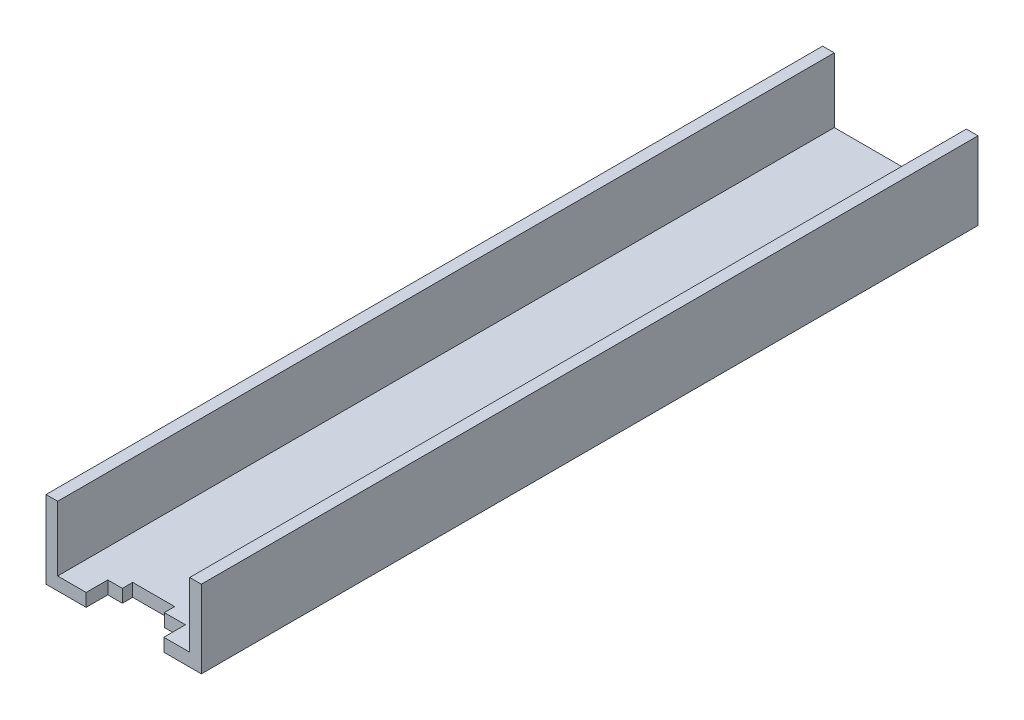
ISO-10303-21;
HEADER;
FILE_DESCRIPTION(('STEP AP214'),'2;1');
FILE_NAME('part.step','',(''),(''),'','','');
FILE_SCHEMA(('AUTOMOTIVE_DESIGN { 1 0 10303 214 1 1 1 1 }'));
ENDSEC;
DATA;
#1=APPLICATION_CONTEXT('core data for automotive mechanical design processes');
#2=APPLICATION_PROTOCOL_DEFINITION('international standard','automotive_design',2000,#1);
#3=PRODUCT_CONTEXT('',#1,'mechanical');
#4=PRODUCT('Part','Part','',(#3));
#5=PRODUCT_RELATED_PRODUCT_CATEGORY('part','',(#4));
#6=PRODUCT_DEFINITION_FORMATION('','',#4);
#7=PRODUCT_DEFINITION_CONTEXT('part definition',#1,'design');
#8=PRODUCT_DEFINITION('design','',#6,#7);
#9=PRODUCT_DEFINITION_SHAPE('','',#8);
#10=(LENGTH_UNIT() NAMED_UNIT(*) SI_UNIT(.MILLI.,.METRE.));
#11=(NAMED_UNIT(*) PLANE_ANGLE_UNIT() SI_UNIT($,.RADIAN.));
#12=(NAMED_UNIT(*) SI_UNIT($,.STERADIAN.) SOLID_ANGLE_UNIT());
#13=UNCERTAINTY_MEASURE_WITH_UNIT(LENGTH_MEASURE(1.E-05),#10,'distance_accuracy_value','');
#14=(GEOMETRIC_REPRESENTATION_CONTEXT(3) GLOBAL_UNCERTAINTY_ASSIGNED_CONTEXT((#13)) GLOBAL_UNIT_ASSIGNED_CONTEXT((#10,
#11,#12)) REPRESENTATION_CONTEXT('',''));
#15=CARTESIAN_POINT('',(0.,0.,0.));
#16=DIRECTION('',(0.,0.,1.));
#17=DIRECTION('',(1.,0.,0.));
#18=AXIS2_PLACEMENT_3D('',#15,#16,#17);
#19=CARTESIAN_POINT('',(-1.45,-1.,29.1635501731022));
#20=DIRECTION('',(0.,0.,-1.));
#21=DIRECTION('',(-1.,0.,0.));
#22=AXIS2_PLACEMENT_3D('',#19,#20,#21);
#23=PLANE('',#22);
#24=DIRECTION('',(0.,-1.,0.));
#25=VECTOR('',#24,1.);
#26=CARTESIAN_POINT('',(0.733411523667505,-1.,29.1635501731022));
#27=LINE('',#26,#25);
#28=CARTESIAN_POINT('',(0.733411523667505,-1.,29.1635501731022));
#29=VERTEX_POINT('',#28);
#30=CARTESIAN_POINT('',(0.733411523667505,-1.5,29.1635501731022));
#31=VERTEX_POINT('',#30);
#32=EDGE_CURVE('E181',#29,#31,#27,.T.);
#33=ORIENTED_EDGE('',*,*,#32,.T.);
#34=DIRECTION('',(1.,0.,0.));
#35=VECTOR('',#34,1.);
#36=CARTESIAN_POINT('',(-1.45,-1.5,29.1635501731022));
#37=LINE('',#36,#35);
#38=CARTESIAN_POINT('',(1.55,-1.5,29.1635501731022));
#39=VERTEX_POINT('',#38);
#40=EDGE_CURVE('E193',#31,#39,#37,.T.);
#41=ORIENTED_EDGE('',*,*,#40,.T.);
#42=DIRECTION('',(0.,-1.,0.));
#43=VECTOR('',#42,1.);
#44=CARTESIAN_POINT('',(1.55,-1.,29.1635501731022));
#45=LINE('',#44,#43);
#46=CARTESIAN_POINT('',(1.55,-1.,29.1635501731022));
#47=VERTEX_POINT('',#46);
#48=EDGE_CURVE('E204',#47,#39,#45,.T.);
#49=ORIENTED_EDGE('',*,*,#48,.F.);
#50=DIRECTION('',(1.,0.,0.));
#51=VECTOR('',#50,1.);
#52=CARTESIAN_POINT('',(-1.45,-1.,29.1635501731022));
#53=LINE('',#52,#51);
#54=EDGE_CURVE('E56',#29,#47,#53,.T.);
#55=ORIENTED_EDGE('',*,*,#54,.F.);
#56=EDGE_LOOP('',(#33,#41,#49,#55));
#57=FACE_BOUND('',#56,.T.);
#58=ADVANCED_FACE('F33',(#57),#23,.F.);
#59=CARTESIAN_POINT('',(0.,0.,30.));
#60=DIRECTION('',(0.,0.,1.));
#61=DIRECTION('',(1.,0.,0.));
#62=AXIS2_PLACEMENT_3D('',#59,#60,#61);
#63=PLANE('',#62);
#64=DIRECTION('',(0.,-1.,0.));
#65=VECTOR('',#64,1.);
#66=CARTESIAN_POINT('',(-1.45,-1.,30.));
#67=LINE('',#66,#65);
#68=CARTESIAN_POINT('',(-1.45,-1.,30.));
#69=VERTEX_POINT('',#68);
#70=CARTESIAN_POINT('',(-1.45,-1.5,30.));
#71=VERTEX_POINT('',#70);
#72=EDGE_CURVE('E198',#69,#71,#67,.T.);
#73=ORIENTED_EDGE('',*,*,#72,.F.);
#74=DIRECTION('',(1.,0.,0.));
#75=VECTOR('',#74,1.);
#76=CARTESIAN_POINT('',(-2.55,-1.,30.));
#77=LINE('',#76,#75);
#78=CARTESIAN_POINT('',(-2.55,-1.,30.));
#79=VERTEX_POINT('',#78);
#80=EDGE_CURVE('E221',#79,#69,#77,.T.);
#81=ORIENTED_EDGE('',*,*,#80,.F.);
#82=DIRECTION('',(0.,-1.,0.));
#83=VECTOR('',#82,1.);
#84=CARTESIAN_POINT('',(-2.55,1.5,30.));
#85=LINE('',#84,#83);
#86=CARTESIAN_POINT('',(-2.55,1.5,30.));
#87=VERTEX_POINT('',#86);
#88=EDGE_CURVE('E211',#87,#79,#85,.T.);
#89=ORIENTED_EDGE('',*,*,#88,.F.);
#90=DIRECTION('',(1.,0.,0.));
#91=VECTOR('',#90,1.);
#92=CARTESIAN_POINT('',(-3.,1.5,30.));
#93=LINE('',#92,#91);
#94=CARTESIAN_POINT('',(-3.,1.5,30.));
#95=VERTEX_POINT('',#94);
#96=EDGE_CURVE('E248',#95,#87,#93,.T.);
#97=ORIENTED_EDGE('',*,*,#96,.F.);
#98=DIRECTION('',(0.,-1.,0.));
#99=VECTOR('',#98,1.);
#100=CARTESIAN_POINT('',(-3.,1.5,30.));
#101=LINE('',#100,#99);
#102=CARTESIAN_POINT('',(-3.,-1.5,30.));
#103=VERTEX_POINT('',#102);
#104=EDGE_CURVE('E236',#95,#103,#101,.T.);
#105=ORIENTED_EDGE('',*,*,#104,.T.);
#106=DIRECTION('',(1.,0.,0.));
#107=VECTOR('',#106,1.);
#108=CARTESIAN_POINT('',(-3.,-1.5,30.));
#109=LINE('',#108,#107);
#110=EDGE_CURVE('E241',#103,#71,#109,.T.);
#111=ORIENTED_EDGE('',*,*,#110,.T.);
#112=EDGE_LOOP('',(#73,#81,#89,#97,#105,#111));
#113=FACE_BOUND('',#112,.T.);
#114=ADVANCED_FACE('F302',(#113),#63,.T.);
#115=CARTESIAN_POINT('',(-3.,1.5,30.));
#116=DIRECTION('',(0.,1.,0.));
#117=DIRECTION('',(0.,0.,1.));
#118=AXIS2_PLACEMENT_3D('',#115,#116,#117);
#119=PLANE('',#118);
#120=DIRECTION('',(1.,0.,0.));
#121=VECTOR('',#120,1.);
#122=CARTESIAN_POINT('',(-3.,1.5,0.));
#123=LINE('',#122,#121);
#124=CARTESIAN_POINT('',(2.55,1.5,0.));
#125=VERTEX_POINT('',#124);
#126=CARTESIAN_POINT('',(3.,1.5,0.));
#127=VERTEX_POINT('',#126);
#128=EDGE_CURVE('E260',#125,#127,#123,.T.);
#129=ORIENTED_EDGE('',*,*,#128,.F.);
#130=DIRECTION('',(0.,0.,1.));
#131=VECTOR('',#130,1.);
#132=CARTESIAN_POINT('',(2.55,1.5,0.));
#133=LINE('',#132,#131);
#134=CARTESIAN_POINT('',(2.55,1.5,30.));
#135=VERTEX_POINT('',#134);
#136=EDGE_CURVE('E232',#125,#135,#133,.T.);
#137=ORIENTED_EDGE('',*,*,#136,.T.);
#138=CARTESIAN_POINT('',(3.,1.5,30.));
#139=VERTEX_POINT('',#138);
#140=EDGE_CURVE('E247',#135,#139,#93,.T.);
#141=ORIENTED_EDGE('',*,*,#140,.T.);
#142=DIRECTION('',(0.,0.,-1.));
#143=VECTOR('',#142,1.);
#144=CARTESIAN_POINT('',(3.,1.5,30.));
#145=LINE('',#144,#143);
#146=EDGE_CURVE('E264',#139,#127,#145,.T.);
#147=ORIENTED_EDGE('',*,*,#146,.T.);
#148=EDGE_LOOP('',(#129,#137,#141,#147));
#149=FACE_BOUND('',#148,.T.);
#150=ADVANCED_FACE('F282',(#149),#119,.T.);
#151=DIRECTION('',(0.,-1.,0.));
#152=VECTOR('',#151,1.);
#153=CARTESIAN_POINT('',(1.55,-1.,30.));
#154=LINE('',#153,#152);
#155=CARTESIAN_POINT('',(1.55,-1.,30.));
#156=VERTEX_POINT('',#155);
#157=CARTESIAN_POINT('',(1.55,-1.5,30.));
#158=VERTEX_POINT('',#157);
#159=EDGE_CURVE('E201',#156,#158,#154,.T.);
#160=ORIENTED_EDGE('',*,*,#159,.T.);
#161=CARTESIAN_POINT('',(3.,-1.5,30.));
#162=VERTEX_POINT('',#161);
#163=EDGE_CURVE('E239',#158,#162,#109,.T.);
#164=ORIENTED_EDGE('',*,*,#163,.T.);
#165=DIRECTION('',(0.,-1.,0.));
#166=VECTOR('',#165,1.);
#167=CARTESIAN_POINT('',(3.,1.5,30.));
#168=LINE('',#167,#166);
#169=EDGE_CURVE('E244',#139,#162,#168,.T.);
#170=ORIENTED_EDGE('',*,*,#169,.F.);
#171=ORIENTED_EDGE('',*,*,#140,.F.);
#172=DIRECTION('',(0.,-1.,0.));
#173=VECTOR('',#172,1.);
#174=CARTESIAN_POINT('',(2.55,1.5,30.));
#175=LINE('',#174,#173);
#176=CARTESIAN_POINT('',(2.55,-1.,30.));
#177=VERTEX_POINT('',#176);
#178=EDGE_CURVE('E200',#135,#177,#175,.T.);
#179=ORIENTED_EDGE('',*,*,#178,.T.);
#180=EDGE_CURVE('E220',#156,#177,#77,.T.);
#181=ORIENTED_EDGE('',*,*,#180,.F.);
#182=EDGE_LOOP('',(#160,#164,#170,#171,#179,#181));
#183=FACE_BOUND('',#182,.T.);
#184=ADVANCED_FACE('F285',(#183),#63,.T.);
#185=CARTESIAN_POINT('',(0.,0.,0.));
#186=DIRECTION('',(0.,0.,1.));
#187=DIRECTION('',(1.,0.,0.));
#188=AXIS2_PLACEMENT_3D('',#185,#186,#187);
#189=PLANE('',#188);
#190=DIRECTION('',(0.,-1.,0.));
#191=VECTOR('',#190,1.);
#192=CARTESIAN_POINT('',(2.55,1.5,0.));
#193=LINE('',#192,#191);
#194=CARTESIAN_POINT('',(2.55,-1.,0.));
#195=VERTEX_POINT('',#194);
#196=EDGE_CURVE('E208',#125,#195,#193,.T.);
#197=ORIENTED_EDGE('',*,*,#196,.F.);
#198=ORIENTED_EDGE('',*,*,#128,.T.);
#199=DIRECTION('',(0.,-1.,0.));
#200=VECTOR('',#199,1.);
#201=CARTESIAN_POINT('',(3.,1.5,0.));
#202=LINE('',#201,#200);
#203=CARTESIAN_POINT('',(3.,-1.5,0.));
#204=VERTEX_POINT('',#203);
#205=EDGE_CURVE('E257',#127,#204,#202,.T.);
#206=ORIENTED_EDGE('',*,*,#205,.T.);
#207=DIRECTION('',(1.,0.,0.));
#208=VECTOR('',#207,1.);
#209=CARTESIAN_POINT('',(-3.,-1.5,0.));
#210=LINE('',#209,#208);
#211=CARTESIAN_POINT('',(-3.,-1.5,0.));
#212=VERTEX_POINT('',#211);
#213=EDGE_CURVE('E254',#212,#204,#210,.T.);
#214=ORIENTED_EDGE('',*,*,#213,.F.);
#215=DIRECTION('',(0.,-1.,0.));
#216=VECTOR('',#215,1.);
#217=CARTESIAN_POINT('',(-3.,1.5,0.));
#218=LINE('',#217,#216);
#219=CARTESIAN_POINT('',(-3.,1.5,0.));
#220=VERTEX_POINT('',#219);
#221=EDGE_CURVE('E235',#220,#212,#218,.T.);
#222=ORIENTED_EDGE('',*,*,#221,.F.);
#223=CARTESIAN_POINT('',(-2.55,1.5,0.));
#224=VERTEX_POINT('',#223);
#225=EDGE_CURVE('E240',#220,#224,#123,.T.);
#226=ORIENTED_EDGE('',*,*,#225,.T.);
#227=DIRECTION('',(0.,-1.,0.));
#228=VECTOR('',#227,1.);
#229=CARTESIAN_POINT('',(-2.55,1.5,0.));
#230=LINE('',#229,#228);
#231=CARTESIAN_POINT('',(-2.55,-1.,0.));
#232=VERTEX_POINT('',#231);
#233=EDGE_CURVE('E214',#224,#232,#230,.T.);
#234=ORIENTED_EDGE('',*,*,#233,.T.);
#235=DIRECTION('',(1.,0.,0.));
#236=VECTOR('',#235,1.);
#237=CARTESIAN_POINT('',(-2.55,-1.,0.));
#238=LINE('',#237,#236);
#239=EDGE_CURVE('E210',#232,#195,#238,.T.);
#240=ORIENTED_EDGE('',*,*,#239,.T.);
#241=EDGE_LOOP('',(#197,#198,#206,#214,#222,#226,#234,#240));
#242=FACE_BOUND('',#241,.T.);
#243=ADVANCED_FACE('F279',(#242),#189,.F.);
#244=CARTESIAN_POINT('',(-3.,1.5,30.));
#245=DIRECTION('',(1.,0.,0.));
#246=DIRECTION('',(0.,1.,0.));
#247=AXIS2_PLACEMENT_3D('',#244,#245,#246);
#248=PLANE('',#247);
#249=ORIENTED_EDGE('',*,*,#221,.T.);
#250=DIRECTION('',(0.,0.,-1.));
#251=VECTOR('',#250,1.);
#252=CARTESIAN_POINT('',(-3.,-1.5,30.));
#253=LINE('',#252,#251);
#254=EDGE_CURVE('E11',#103,#212,#253,.T.);
#255=ORIENTED_EDGE('',*,*,#254,.F.);
#256=ORIENTED_EDGE('',*,*,#104,.F.);
#257=DIRECTION('',(0.,0.,-1.));
#258=VECTOR('',#257,1.);
#259=CARTESIAN_POINT('',(-3.,1.5,30.));
#260=LINE('',#259,#258);
#261=EDGE_CURVE('E251',#95,#220,#260,.T.);
#262=ORIENTED_EDGE('',*,*,#261,.T.);
#263=EDGE_LOOP('',(#249,#255,#256,#262));
#264=FACE_BOUND('',#263,.T.);
#265=ADVANCED_FACE('F35',(#264),#248,.F.);
#266=CARTESIAN_POINT('',(-3.,-1.5,30.));
#267=DIRECTION('',(0.,1.,0.));
#268=DIRECTION('',(0.,0.,1.));
#269=AXIS2_PLACEMENT_3D('',#266,#267,#268);
#270=PLANE('',#269);
#271=DIRECTION('',(1.,0.,0.));
#272=VECTOR('',#271,1.);
#273=CARTESIAN_POINT('',(-0.886588476332495,-1.5,28.7635501731022));
#274=LINE('',#273,#272);
#275=CARTESIAN_POINT('',(-0.886588476332495,-1.5,28.7635501731022));
#276=VERTEX_POINT('',#275);
#277=CARTESIAN_POINT('',(0.733411523667505,-1.5,28.7635501731022));
#278=VERTEX_POINT('',#277);
#279=EDGE_CURVE('E172',#276,#278,#274,.T.);
#280=ORIENTED_EDGE('',*,*,#279,.F.);
#281=DIRECTION('',(0.,0.,-1.));
#282=VECTOR('',#281,1.);
#283=CARTESIAN_POINT('',(-0.886588476332495,-1.5,29.1635501731022));
#284=LINE('',#283,#282);
#285=CARTESIAN_POINT('',(-0.886588476332495,-1.5,29.1635501731022));
#286=VERTEX_POINT('',#285);
#287=EDGE_CURVE('E154',#286,#276,#284,.T.);
#288=ORIENTED_EDGE('',*,*,#287,.F.);
#289=CARTESIAN_POINT('',(-1.45,-1.5,29.1635501731022));
#290=VERTEX_POINT('',#289);
#291=EDGE_CURVE('E194',#290,#286,#37,.T.);
#292=ORIENTED_EDGE('',*,*,#291,.F.);
#293=DIRECTION('',(0.,0.,-1.));
#294=VECTOR('',#293,1.);
#295=CARTESIAN_POINT('',(-1.45,-1.5,30.));
#296=LINE('',#295,#294);
#297=EDGE_CURVE('E180',#71,#290,#296,.T.);
#298=ORIENTED_EDGE('',*,*,#297,.F.);
#299=ORIENTED_EDGE('',*,*,#110,.F.);
#300=ORIENTED_EDGE('',*,*,#254,.T.);
#301=ORIENTED_EDGE('',*,*,#213,.T.);
#302=DIRECTION('',(0.,0.,-1.));
#303=VECTOR('',#302,1.);
#304=CARTESIAN_POINT('',(3.,-1.5,30.));
#305=LINE('',#304,#303);
#306=EDGE_CURVE('E41',#162,#204,#305,.T.);
#307=ORIENTED_EDGE('',*,*,#306,.F.);
#308=ORIENTED_EDGE('',*,*,#163,.F.);
#309=DIRECTION('',(0.,0.,1.));
#310=VECTOR('',#309,1.);
#311=CARTESIAN_POINT('',(1.55,-1.5,30.));
#312=LINE('',#311,#310);
#313=EDGE_CURVE('E186',#39,#158,#312,.T.);
#314=ORIENTED_EDGE('',*,*,#313,.F.);
#315=ORIENTED_EDGE('',*,*,#40,.F.);
#316=DIRECTION('',(0.,0.,-1.));
#317=VECTOR('',#316,1.);
#318=CARTESIAN_POINT('',(0.733411523667505,-1.5,29.1635501731022));
#319=LINE('',#318,#317);
#320=EDGE_CURVE('E48',#31,#278,#319,.T.);
#321=ORIENTED_EDGE('',*,*,#320,.T.);
#322=EDGE_LOOP('',(#280,#288,#292,#298,#299,#300,#301,#307,#308,#314,#315,#321));
#323=FACE_BOUND('',#322,.T.);
#324=ADVANCED_FACE('F274',(#323),#270,.F.);
#325=CARTESIAN_POINT('',(3.,1.5,30.));
#326=DIRECTION('',(1.,0.,0.));
#327=DIRECTION('',(0.,1.,0.));
#328=AXIS2_PLACEMENT_3D('',#325,#326,#327);
#329=PLANE('',#328);
#330=ORIENTED_EDGE('',*,*,#205,.F.);
#331=ORIENTED_EDGE('',*,*,#146,.F.);
#332=ORIENTED_EDGE('',*,*,#169,.T.);
#333=ORIENTED_EDGE('',*,*,#306,.T.);
#334=EDGE_LOOP('',(#330,#331,#332,#333));
#335=FACE_BOUND('',#334,.T.);
#336=ADVANCED_FACE('F269',(#335),#329,.T.);
#337=DIRECTION('',(0.,0.,1.));
#338=VECTOR('',#337,1.);
#339=CARTESIAN_POINT('',(-2.55,1.5,0.));
#340=LINE('',#339,#338);
#341=EDGE_CURVE('E217',#224,#87,#340,.T.);
#342=ORIENTED_EDGE('',*,*,#341,.F.);
#343=ORIENTED_EDGE('',*,*,#225,.F.);
#344=ORIENTED_EDGE('',*,*,#261,.F.);
#345=ORIENTED_EDGE('',*,*,#96,.T.);
#346=EDGE_LOOP('',(#342,#343,#344,#345));
#347=FACE_BOUND('',#346,.T.);
#348=ADVANCED_FACE('F311',(#347),#119,.T.);
#349=CARTESIAN_POINT('',(2.55,1.5,0.));
#350=DIRECTION('',(-1.,0.,0.));
#351=DIRECTION('',(0.,-1.,0.));
#352=AXIS2_PLACEMENT_3D('',#349,#350,#351);
#353=PLANE('',#352);
#354=ORIENTED_EDGE('',*,*,#178,.F.);
#355=ORIENTED_EDGE('',*,*,#136,.F.);
#356=ORIENTED_EDGE('',*,*,#196,.T.);
#357=DIRECTION('',(0.,0.,1.));
#358=VECTOR('',#357,1.);
#359=CARTESIAN_POINT('',(2.55,-1.,0.));
#360=LINE('',#359,#358);
#361=EDGE_CURVE('E229',#195,#177,#360,.T.);
#362=ORIENTED_EDGE('',*,*,#361,.T.);
#363=EDGE_LOOP('',(#354,#355,#356,#362));
#364=FACE_BOUND('',#363,.T.);
#365=ADVANCED_FACE('F317',(#364),#353,.T.);
#366=CARTESIAN_POINT('',(-2.55,-1.,0.));
#367=DIRECTION('',(0.,-1.,0.));
#368=DIRECTION('',(0.,0.,-1.));
#369=AXIS2_PLACEMENT_3D('',#366,#367,#368);
#370=PLANE('',#369);
#371=CARTESIAN_POINT('',(-1.45,-1.,29.1635501731022));
#372=VERTEX_POINT('',#371);
#373=CARTESIAN_POINT('',(-0.886588476332495,-1.,29.1635501731022));
#374=VERTEX_POINT('',#373);
#375=EDGE_CURVE('E170',#372,#374,#53,.T.);
#376=ORIENTED_EDGE('',*,*,#375,.T.);
#377=DIRECTION('',(0.,0.,-1.));
#378=VECTOR('',#377,1.);
#379=CARTESIAN_POINT('',(-0.886588476332495,-1.,29.1635501731022));
#380=LINE('',#379,#378);
#381=CARTESIAN_POINT('',(-0.886588476332495,-1.,28.7635501731022));
#382=VERTEX_POINT('',#381);
#383=EDGE_CURVE('E151',#374,#382,#380,.T.);
#384=ORIENTED_EDGE('',*,*,#383,.T.);
#385=DIRECTION('',(1.,0.,0.));
#386=VECTOR('',#385,1.);
#387=CARTESIAN_POINT('',(-0.886588476332495,-1.,28.7635501731022));
#388=LINE('',#387,#386);
#389=CARTESIAN_POINT('',(0.733411523667505,-1.,28.7635501731022));
#390=VERTEX_POINT('',#389);
#391=EDGE_CURVE('E163',#382,#390,#388,.T.);
#392=ORIENTED_EDGE('',*,*,#391,.T.);
#393=DIRECTION('',(0.,0.,-1.));
#394=VECTOR('',#393,1.);
#395=CARTESIAN_POINT('',(0.733411523667505,-1.,29.1635501731022));
#396=LINE('',#395,#394);
#397=EDGE_CURVE('E159',#29,#390,#396,.T.);
#398=ORIENTED_EDGE('',*,*,#397,.F.);
#399=ORIENTED_EDGE('',*,*,#54,.T.);
#400=DIRECTION('',(0.,0.,1.));
#401=VECTOR('',#400,1.);
#402=CARTESIAN_POINT('',(1.55,-1.,30.));
#403=LINE('',#402,#401);
#404=EDGE_CURVE('E188',#47,#156,#403,.T.);
#405=ORIENTED_EDGE('',*,*,#404,.T.);
#406=ORIENTED_EDGE('',*,*,#180,.T.);
#407=ORIENTED_EDGE('',*,*,#361,.F.);
#408=ORIENTED_EDGE('',*,*,#239,.F.);
#409=DIRECTION('',(0.,0.,1.));
#410=VECTOR('',#409,1.);
#411=CARTESIAN_POINT('',(-2.55,-1.,0.));
#412=LINE('',#411,#410);
#413=EDGE_CURVE('E227',#232,#79,#412,.T.);
#414=ORIENTED_EDGE('',*,*,#413,.T.);
#415=ORIENTED_EDGE('',*,*,#80,.T.);
#416=DIRECTION('',(0.,0.,-1.));
#417=VECTOR('',#416,1.);
#418=CARTESIAN_POINT('',(-1.45,-1.,30.));
#419=LINE('',#418,#417);
#420=EDGE_CURVE('E184',#69,#372,#419,.T.);
#421=ORIENTED_EDGE('',*,*,#420,.T.);
#422=EDGE_LOOP('',(#376,#384,#392,#398,#399,#405,#406,#407,#408,#414,#415,#421));
#423=FACE_BOUND('',#422,.T.);
#424=ADVANCED_FACE('F167',(#423),#370,.F.);
#425=CARTESIAN_POINT('',(-2.55,1.5,0.));
#426=DIRECTION('',(-1.,0.,0.));
#427=DIRECTION('',(0.,-1.,0.));
#428=AXIS2_PLACEMENT_3D('',#425,#426,#427);
#429=PLANE('',#428);
#430=ORIENTED_EDGE('',*,*,#88,.T.);
#431=ORIENTED_EDGE('',*,*,#413,.F.);
#432=ORIENTED_EDGE('',*,*,#233,.F.);
#433=ORIENTED_EDGE('',*,*,#341,.T.);
#434=EDGE_LOOP('',(#430,#431,#432,#433));
#435=FACE_BOUND('',#434,.T.);
#436=ADVANCED_FACE('F313',(#435),#429,.F.);
#437=CARTESIAN_POINT('',(-1.45,-1.,30.));
#438=DIRECTION('',(-1.,0.,0.));
#439=DIRECTION('',(0.,0.,1.));
#440=AXIS2_PLACEMENT_3D('',#437,#438,#439);
#441=PLANE('',#440);
#442=ORIENTED_EDGE('',*,*,#297,.T.);
#443=DIRECTION('',(0.,-1.,0.));
#444=VECTOR('',#443,1.);
#445=CARTESIAN_POINT('',(-1.45,-1.,29.1635501731022));
#446=LINE('',#445,#444);
#447=EDGE_CURVE('E190',#372,#290,#446,.T.);
#448=ORIENTED_EDGE('',*,*,#447,.F.);
#449=ORIENTED_EDGE('',*,*,#420,.F.);
#450=ORIENTED_EDGE('',*,*,#72,.T.);
#451=EDGE_LOOP('',(#442,#448,#449,#450));
#452=FACE_BOUND('',#451,.T.);
#453=ADVANCED_FACE('F299',(#452),#441,.F.);
#454=CARTESIAN_POINT('',(1.55,-1.,30.));
#455=DIRECTION('',(1.,0.,0.));
#456=DIRECTION('',(0.,0.,-1.));
#457=AXIS2_PLACEMENT_3D('',#454,#455,#456);
#458=PLANE('',#457);
#459=ORIENTED_EDGE('',*,*,#313,.T.);
#460=ORIENTED_EDGE('',*,*,#159,.F.);
#461=ORIENTED_EDGE('',*,*,#404,.F.);
#462=ORIENTED_EDGE('',*,*,#48,.T.);
#463=EDGE_LOOP('',(#459,#460,#461,#462));
#464=FACE_BOUND('',#463,.T.);
#465=ADVANCED_FACE('F290',(#464),#458,.F.);
#466=ORIENTED_EDGE('',*,*,#291,.T.);
#467=DIRECTION('',(0.,-1.,0.));
#468=VECTOR('',#467,1.);
#469=CARTESIAN_POINT('',(-0.886588476332495,-1.,29.1635501731022));
#470=LINE('',#469,#468);
#471=EDGE_CURVE('E178',#374,#286,#470,.T.);
#472=ORIENTED_EDGE('',*,*,#471,.F.);
#473=ORIENTED_EDGE('',*,*,#375,.F.);
#474=ORIENTED_EDGE('',*,*,#447,.T.);
#475=EDGE_LOOP('',(#466,#472,#473,#474));
#476=FACE_BOUND('',#475,.T.);
#477=ADVANCED_FACE('F297',(#476),#23,.F.);
#478=CARTESIAN_POINT('',(-0.886588476332495,-1.,29.1635501731022));
#479=DIRECTION('',(-1.,0.,0.));
#480=DIRECTION('',(0.,0.,1.));
#481=AXIS2_PLACEMENT_3D('',#478,#479,#480);
#482=PLANE('',#481);
#483=ORIENTED_EDGE('',*,*,#287,.T.);
#484=DIRECTION('',(0.,-1.,0.));
#485=VECTOR('',#484,1.);
#486=CARTESIAN_POINT('',(-0.886588476332495,-1.,28.7635501731022));
#487=LINE('',#486,#485);
#488=EDGE_CURVE('E147',#382,#276,#487,.T.);
#489=ORIENTED_EDGE('',*,*,#488,.F.);
#490=ORIENTED_EDGE('',*,*,#383,.F.);
#491=ORIENTED_EDGE('',*,*,#471,.T.);
#492=EDGE_LOOP('',(#483,#489,#490,#491));
#493=FACE_BOUND('',#492,.T.);
#494=ADVANCED_FACE('F149',(#493),#482,.F.);
#495=CARTESIAN_POINT('',(0.733411523667505,-1.,29.1635501731022));
#496=DIRECTION('',(-1.,0.,0.));
#497=DIRECTION('',(0.,0.,1.));
#498=AXIS2_PLACEMENT_3D('',#495,#496,#497);
#499=PLANE('',#498);
#500=ORIENTED_EDGE('',*,*,#320,.F.);
#501=ORIENTED_EDGE('',*,*,#32,.F.);
#502=ORIENTED_EDGE('',*,*,#397,.T.);
#503=DIRECTION('',(0.,-1.,0.));
#504=VECTOR('',#503,1.);
#505=CARTESIAN_POINT('',(0.733411523667505,-1.,28.7635501731022));
#506=LINE('',#505,#504);
#507=EDGE_CURVE('E158',#390,#278,#506,.T.);
#508=ORIENTED_EDGE('',*,*,#507,.T.);
#509=EDGE_LOOP('',(#500,#501,#502,#508));
#510=FACE_BOUND('',#509,.T.);
#511=ADVANCED_FACE('F293',(#510),#499,.T.);
#512=CARTESIAN_POINT('',(-0.886588476332495,-1.,28.7635501731022));
#513=DIRECTION('',(0.,0.,-1.));
#514=DIRECTION('',(-1.,0.,0.));
#515=AXIS2_PLACEMENT_3D('',#512,#513,#514);
#516=PLANE('',#515);
#517=ORIENTED_EDGE('',*,*,#279,.T.);
#518=ORIENTED_EDGE('',*,*,#507,.F.);
#519=ORIENTED_EDGE('',*,*,#391,.F.);
#520=ORIENTED_EDGE('',*,*,#488,.T.);
#521=EDGE_LOOP('',(#517,#518,#519,#520));
#522=FACE_BOUND('',#521,.T.);
#523=ADVANCED_FACE('F164',(#522),#516,.F.);
#524=CLOSED_SHELL('',(#58,#114,#150,#184,#243,#265,#324,#336,#348,#365,#424,#436,#453,#465,#477,
#494,#511,#523));
#525=MANIFOLD_SOLID_BREP('B2',#524);
#526=ADVANCED_BREP_SHAPE_REPRESENTATION('',(#18,#525),#14);
#527=SHAPE_DEFINITION_REPRESENTATION(#9,#526);
ENDSEC;
END-ISO-10303-21;
